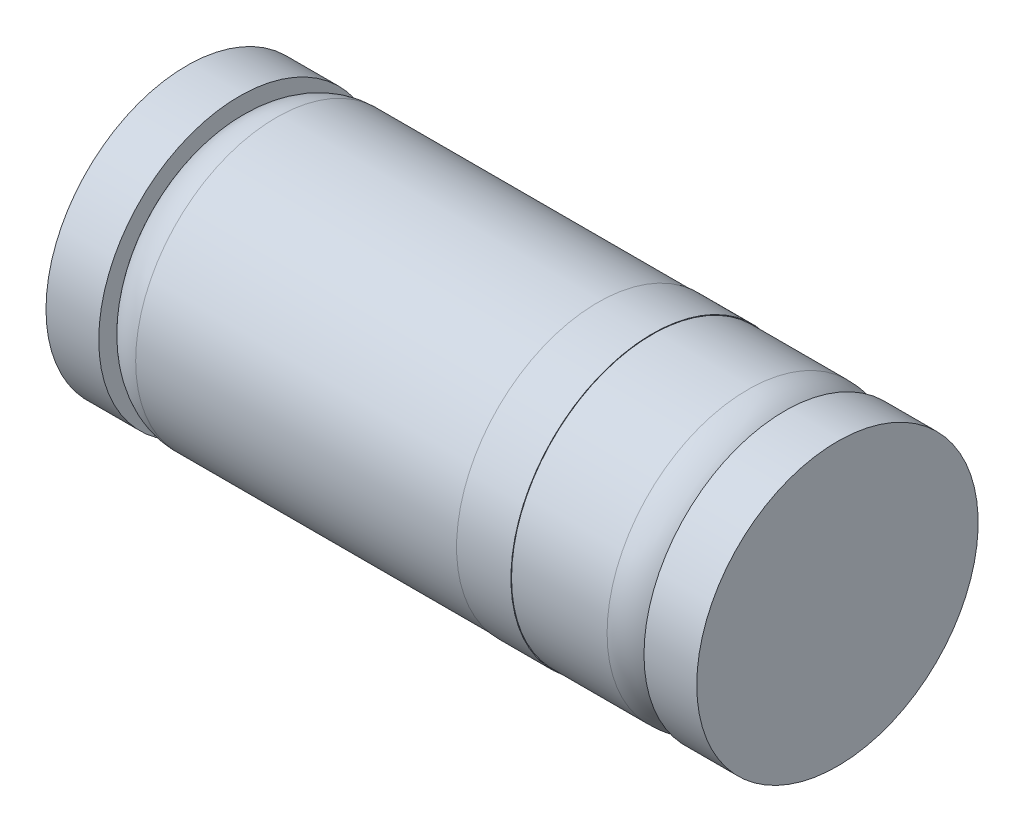
ISO-10303-21;
HEADER;
FILE_DESCRIPTION(('STEP AP214'),'2;1');
FILE_NAME('part.step','',(''),(''),'','','');
FILE_SCHEMA(('AUTOMOTIVE_DESIGN { 1 0 10303 214 1 1 1 1 }'));
ENDSEC;
DATA;
#1=APPLICATION_CONTEXT('core data for automotive mechanical design processes');
#2=APPLICATION_PROTOCOL_DEFINITION('international standard','automotive_design',2000,#1);
#3=PRODUCT_CONTEXT('',#1,'mechanical');
#4=PRODUCT('Part','Part','',(#3));
#5=PRODUCT_RELATED_PRODUCT_CATEGORY('part','',(#4));
#6=PRODUCT_DEFINITION_FORMATION('','',#4);
#7=PRODUCT_DEFINITION_CONTEXT('part definition',#1,'design');
#8=PRODUCT_DEFINITION('design','',#6,#7);
#9=PRODUCT_DEFINITION_SHAPE('','',#8);
#10=(LENGTH_UNIT() NAMED_UNIT(*) SI_UNIT(.MILLI.,.METRE.));
#11=(NAMED_UNIT(*) PLANE_ANGLE_UNIT() SI_UNIT($,.RADIAN.));
#12=(NAMED_UNIT(*) SI_UNIT($,.STERADIAN.) SOLID_ANGLE_UNIT());
#13=UNCERTAINTY_MEASURE_WITH_UNIT(LENGTH_MEASURE(1.E-05),#10,'distance_accuracy_value','');
#14=(GEOMETRIC_REPRESENTATION_CONTEXT(3) GLOBAL_UNCERTAINTY_ASSIGNED_CONTEXT((#13)) GLOBAL_UNIT_ASSIGNED_CONTEXT((#10,
#11,#12)) REPRESENTATION_CONTEXT('',''));
#15=CARTESIAN_POINT('',(0.,0.,0.));
#16=DIRECTION('',(0.,0.,1.));
#17=DIRECTION('',(1.,0.,0.));
#18=AXIS2_PLACEMENT_3D('',#15,#16,#17);
#19=CARTESIAN_POINT('',(-25.7120986119701,9.99999999999995,0.799999999999995));
#20=DIRECTION('',(-1.,0.,0.));
#21=DIRECTION('',(0.,0.,1.));
#22=AXIS2_PLACEMENT_3D('',#19,#20,#21);
#23=PLANE('',#22);
#24=CARTESIAN_POINT('',(-25.71209861197,9.19999999999994,0.799999999999995));
#25=DIRECTION('',(1.,0.,0.));
#26=DIRECTION('',(0.,0.,-1.));
#27=AXIS2_PLACEMENT_3D('',#24,#25,#26);
#28=CIRCLE('',#27,0.803520381198);
#29=CARTESIAN_POINT('',(-25.71209861197,9.19999999999994,-0.00352038119800482));
#30=VERTEX_POINT('',#29);
#31=EDGE_CURVE('P0_E17',#30,#30,#28,.T.);
#32=ORIENTED_EDGE('',*,*,#31,.F.);
#33=EDGE_LOOP('',(#32));
#34=FACE_BOUND('',#33,.T.);
#35=ADVANCED_FACE('P0_F14',(#34),#23,.T.);
#36=CARTESIAN_POINT('',(-25.40309439956,9.2,0.799999999999995));
#37=DIRECTION('',(1.,0.,0.));
#38=DIRECTION('',(0.,0.,-1.));
#39=AXIS2_PLACEMENT_3D('',#36,#37,#38);
#40=CYLINDRICAL_SURFACE('',#39,0.803520381198);
#41=ORIENTED_EDGE('',*,*,#31,.T.);
#42=EDGE_LOOP('',(#41));
#43=FACE_BOUND('',#42,.T.);
#44=CARTESIAN_POINT('',(-25.40309439956,9.2,0.799999999999995));
#45=DIRECTION('',(1.,0.,0.));
#46=DIRECTION('',(0.,0.,-1.));
#47=AXIS2_PLACEMENT_3D('',#44,#45,#46);
#48=CIRCLE('',#47,0.803520381198);
#49=CARTESIAN_POINT('',(-25.40309439956,9.2,-0.00352038119800482));
#50=VERTEX_POINT('',#49);
#51=EDGE_CURVE('P0_E10',#50,#50,#48,.T.);
#52=ORIENTED_EDGE('',*,*,#51,.F.);
#53=EDGE_LOOP('',(#52));
#54=FACE_BOUND('',#53,.T.);
#55=ADVANCED_FACE('P0_F26',(#43,#54),#40,.T.);
#56=CARTESIAN_POINT('',(-25.4030943995601,9.99999999999999,0.799999999999995));
#57=DIRECTION('',(1.,0.,0.));
#58=DIRECTION('',(0.,0.,-1.));
#59=AXIS2_PLACEMENT_3D('',#56,#57,#58);
#60=PLANE('',#59);
#61=ORIENTED_EDGE('',*,*,#51,.T.);
#62=EDGE_LOOP('',(#61));
#63=FACE_BOUND('',#62,.T.);
#64=ADVANCED_FACE('P0_F34',(#63),#60,.T.);
#65=CLOSED_SHELL('',(#35,#55,#64));
#66=MANIFOLD_SOLID_BREP('P0_B1',#65);
#67=CARTESIAN_POINT('',(-24.35,9.2,0.799999999999995));
#68=DIRECTION('',(-1.,0.,0.));
#69=DIRECTION('',(0.,0.,1.));
#70=AXIS2_PLACEMENT_3D('',#67,#68,#69);
#71=PLANE('',#70);
#72=CARTESIAN_POINT('',(-24.35,9.2,0.799999999999995));
#73=DIRECTION('',(-1.,0.,0.));
#74=DIRECTION('',(0.,0.,1.));
#75=AXIS2_PLACEMENT_3D('',#72,#73,#74);
#76=CIRCLE('',#75,0.8);
#77=CARTESIAN_POINT('',(-24.35,9.2,1.59999999999999));
#78=VERTEX_POINT('',#77);
#79=EDGE_CURVE('P1_E17',#78,#78,#76,.T.);
#80=ORIENTED_EDGE('',*,*,#79,.F.);
#81=EDGE_LOOP('',(#80));
#82=FACE_BOUND('',#81,.T.);
#83=ADVANCED_FACE('P1_F14',(#82),#71,.F.);
#84=CARTESIAN_POINT('',(-28.05,9.19999999999994,0.799999999999988));
#85=DIRECTION('',(1.,0.,0.));
#86=DIRECTION('',(0.,0.,-1.));
#87=AXIS2_PLACEMENT_3D('',#84,#85,#86);
#88=PLANE('',#87);
#89=CARTESIAN_POINT('',(-28.05,9.19999999999994,0.799999999999988));
#90=DIRECTION('',(-1.,0.,0.));
#91=DIRECTION('',(0.,0.,1.));
#92=AXIS2_PLACEMENT_3D('',#89,#90,#91);
#93=CIRCLE('',#92,0.8);
#94=CARTESIAN_POINT('',(-28.05,9.19999999999994,1.59999999999999));
#95=VERTEX_POINT('',#94);
#96=EDGE_CURVE('P1_E61',#95,#95,#93,.F.);
#97=ORIENTED_EDGE('',*,*,#96,.F.);
#98=EDGE_LOOP('',(#97));
#99=FACE_BOUND('',#98,.T.);
#100=ADVANCED_FACE('P1_F71',(#99),#88,.F.);
#101=CARTESIAN_POINT('',(-28.05,9.19999999999994,0.799999999999988));
#102=DIRECTION('',(-1.,0.,0.));
#103=DIRECTION('',(0.,0.,1.));
#104=AXIS2_PLACEMENT_3D('',#101,#102,#103);
#105=CYLINDRICAL_SURFACE('',#104,0.8);
#106=CARTESIAN_POINT('',(-24.65,9.2,0.799999999999995));
#107=DIRECTION('',(-1.,0.,0.));
#108=DIRECTION('',(0.,0.,1.));
#109=AXIS2_PLACEMENT_3D('',#106,#107,#108);
#110=CIRCLE('',#109,0.8);
#111=CARTESIAN_POINT('',(-24.65,9.2,1.59999999999999));
#112=VERTEX_POINT('',#111);
#113=EDGE_CURVE('P1_E59',#112,#112,#110,.F.);
#114=ORIENTED_EDGE('',*,*,#113,.T.);
#115=EDGE_LOOP('',(#114));
#116=FACE_BOUND('',#115,.T.);
#117=ORIENTED_EDGE('',*,*,#79,.T.);
#118=EDGE_LOOP('',(#117));
#119=FACE_BOUND('',#118,.T.);
#120=ADVANCED_FACE('P1_F68',(#116,#119),#105,.T.);
#121=CARTESIAN_POINT('',(-28.05,9.19999999999994,0.799999999999988));
#122=DIRECTION('',(-1.,0.,0.));
#123=DIRECTION('',(0.,0.,1.));
#124=AXIS2_PLACEMENT_3D('',#121,#122,#123);
#125=CYLINDRICAL_SURFACE('',#124,0.8);
#126=ORIENTED_EDGE('',*,*,#96,.T.);
#127=EDGE_LOOP('',(#126));
#128=FACE_BOUND('',#127,.T.);
#129=CARTESIAN_POINT('',(-27.75,9.19999999999994,0.799999999999995));
#130=DIRECTION('',(-1.,0.,0.));
#131=DIRECTION('',(0.,0.,1.));
#132=AXIS2_PLACEMENT_3D('',#129,#130,#131);
#133=CIRCLE('',#132,0.8);
#134=CARTESIAN_POINT('',(-27.75,9.19999999999994,1.59999999999999));
#135=VERTEX_POINT('',#134);
#136=EDGE_CURVE('P1_E56',#135,#135,#133,.T.);
#137=ORIENTED_EDGE('',*,*,#136,.T.);
#138=EDGE_LOOP('',(#137));
#139=FACE_BOUND('',#138,.T.);
#140=ADVANCED_FACE('P1_F93',(#128,#139),#125,.T.);
#141=CARTESIAN_POINT('',(-24.6500000000001,9.99999999999999,0.799999999999995));
#142=DIRECTION('',(1.,0.,0.));
#143=DIRECTION('',(0.,0.,-1.));
#144=AXIS2_PLACEMENT_3D('',#141,#142,#143);
#145=PLANE('',#144);
#146=ORIENTED_EDGE('',*,*,#113,.F.);
#147=EDGE_LOOP('',(#146));
#148=FACE_BOUND('',#147,.T.);
#149=CARTESIAN_POINT('',(-24.6500000000575,9.2,0.799999999999995));
#150=DIRECTION('',(-1.,0.,0.));
#151=DIRECTION('',(0.,0.,1.));
#152=AXIS2_PLACEMENT_3D('',#149,#150,#151);
#153=CIRCLE('',#152,0.693019955690488);
#154=CARTESIAN_POINT('',(-24.6500000000575,9.2,1.49301995569048));
#155=VERTEX_POINT('',#154);
#156=EDGE_CURVE('P1_E53',#155,#155,#153,.T.);
#157=ORIENTED_EDGE('',*,*,#156,.F.);
#158=EDGE_LOOP('',(#157));
#159=FACE_BOUND('',#158,.T.);
#160=ADVANCED_FACE('P1_F91',(#148,#159),#145,.F.);
#161=CARTESIAN_POINT('',(-27.75,9.99999999999995,0.799999999999995));
#162=DIRECTION('',(-1.,0.,0.));
#163=DIRECTION('',(0.,0.,1.));
#164=AXIS2_PLACEMENT_3D('',#161,#162,#163);
#165=PLANE('',#164);
#166=CARTESIAN_POINT('',(-27.7499999998927,9.19999999999994,0.799999999999995));
#167=DIRECTION('',(1.,0.,0.));
#168=DIRECTION('',(0.,0.,-1.));
#169=AXIS2_PLACEMENT_3D('',#166,#167,#168);
#170=CIRCLE('',#169,0.693019955690488);
#171=CARTESIAN_POINT('',(-27.7499999998927,9.19999999999994,0.106980044309507));
#172=VERTEX_POINT('',#171);
#173=EDGE_CURVE('P1_E50',#172,#172,#170,.T.);
#174=ORIENTED_EDGE('',*,*,#173,.F.);
#175=EDGE_LOOP('',(#174));
#176=FACE_BOUND('',#175,.T.);
#177=ORIENTED_EDGE('',*,*,#136,.F.);
#178=EDGE_LOOP('',(#177));
#179=FACE_BOUND('',#178,.T.);
#180=ADVANCED_FACE('P1_F88',(#176,#179),#165,.F.);
#181=CARTESIAN_POINT('',(-24.6510787919192,9.2,0.799999999999995));
#182=DIRECTION('',(-1.,0.,0.));
#183=DIRECTION('',(0.,0.,1.));
#184=AXIS2_PLACEMENT_3D('',#181,#182,#183);
#185=CONICAL_SURFACE('',#184,0.694485076648289,0.936110716331469);
#186=CARTESIAN_POINT('',(-24.6510787920219,9.2,0.799999999999995));
#187=DIRECTION('',(-1.,0.,0.));
#188=DIRECTION('',(0.,0.,1.));
#189=AXIS2_PLACEMENT_3D('',#186,#187,#188);
#190=CIRCLE('',#189,0.694485076845569);
#191=CARTESIAN_POINT('',(-24.6510787920219,9.2,1.49448507684556));
#192=VERTEX_POINT('',#191);
#193=EDGE_CURVE('P1_E47',#192,#192,#190,.T.);
#194=ORIENTED_EDGE('',*,*,#193,.F.);
#195=EDGE_LOOP('',(#194));
#196=FACE_BOUND('',#195,.T.);
#197=ORIENTED_EDGE('',*,*,#156,.T.);
#198=EDGE_LOOP('',(#197));
#199=FACE_BOUND('',#198,.T.);
#200=ADVANCED_FACE('P1_F85',(#196,#199),#185,.T.);
#201=CARTESIAN_POINT('',(-27.7489212078876,9.19999999999994,0.799999999999995));
#202=DIRECTION('',(1.,0.,0.));
#203=DIRECTION('',(0.,0.,-1.));
#204=AXIS2_PLACEMENT_3D('',#201,#202,#203);
#205=CONICAL_SURFACE('',#204,0.694485076765704,0.936110691173423);
#206=CARTESIAN_POINT('',(-27.7489212079681,9.19999999999994,0.799999999999995));
#207=DIRECTION('',(-1.,0.,0.));
#208=DIRECTION('',(0.,0.,1.));
#209=AXIS2_PLACEMENT_3D('',#206,#207,#208);
#210=CIRCLE('',#209,0.694485076845569);
#211=CARTESIAN_POINT('',(-27.7489212079681,9.19999999999994,1.49448507684556));
#212=VERTEX_POINT('',#211);
#213=EDGE_CURVE('P1_E26',#212,#212,#210,.F.);
#214=ORIENTED_EDGE('',*,*,#213,.F.);
#215=EDGE_LOOP('',(#214));
#216=FACE_BOUND('',#215,.T.);
#217=ORIENTED_EDGE('',*,*,#173,.T.);
#218=EDGE_LOOP('',(#217));
#219=FACE_BOUND('',#218,.T.);
#220=ADVANCED_FACE('P1_F42',(#216,#219),#205,.T.);
#221=CARTESIAN_POINT('',(-24.85980352904,9.2,0.799999999999995));
#222=DIRECTION('',(-1.,0.,0.));
#223=DIRECTION('',(0.,0.,1.));
#224=AXIS2_PLACEMENT_3D('',#221,#222,#223);
#225=TOROIDAL_SURFACE('',#224,0.540797731656002,0.259202268344);
#226=CARTESIAN_POINT('',(-24.85980352904,9.2,0.799999999999995));
#227=DIRECTION('',(-1.,0.,0.));
#228=DIRECTION('',(0.,0.,1.));
#229=AXIS2_PLACEMENT_3D('',#226,#227,#228);
#230=CIRCLE('',#229,0.8);
#231=CARTESIAN_POINT('',(-24.85980352904,9.2,1.59999999999999));
#232=VERTEX_POINT('',#231);
#233=EDGE_CURVE('P1_E21',#232,#232,#230,.T.);
#234=ORIENTED_EDGE('',*,*,#233,.F.);
#235=EDGE_LOOP('',(#234));
#236=FACE_BOUND('',#235,.T.);
#237=ORIENTED_EDGE('',*,*,#193,.T.);
#238=EDGE_LOOP('',(#237));
#239=FACE_BOUND('',#238,.T.);
#240=ADVANCED_FACE('P1_F38',(#236,#239),#225,.T.);
#241=CARTESIAN_POINT('',(-27.54019647095,9.19999999999994,0.799999999999995));
#242=DIRECTION('',(-1.,0.,0.));
#243=DIRECTION('',(0.,0.,1.));
#244=AXIS2_PLACEMENT_3D('',#241,#242,#243);
#245=TOROIDAL_SURFACE('',#244,0.540797731656002,0.259202268344);
#246=ORIENTED_EDGE('',*,*,#213,.T.);
#247=EDGE_LOOP('',(#246));
#248=FACE_BOUND('',#247,.T.);
#249=CARTESIAN_POINT('',(-27.54019647095,9.19999999999994,0.799999999999995));
#250=DIRECTION('',(-1.,0.,0.));
#251=DIRECTION('',(0.,0.,1.));
#252=AXIS2_PLACEMENT_3D('',#249,#250,#251);
#253=CIRCLE('',#252,0.8);
#254=CARTESIAN_POINT('',(-27.54019647095,9.19999999999994,1.59999999999999));
#255=VERTEX_POINT('',#254);
#256=EDGE_CURVE('P1_E10',#255,#255,#253,.F.);
#257=ORIENTED_EDGE('',*,*,#256,.F.);
#258=EDGE_LOOP('',(#257));
#259=FACE_BOUND('',#258,.T.);
#260=ADVANCED_FACE('P1_F33',(#248,#259),#245,.T.);
#261=CARTESIAN_POINT('',(-28.05,9.19999999999994,0.799999999999988));
#262=DIRECTION('',(-1.,0.,0.));
#263=DIRECTION('',(0.,0.,1.));
#264=AXIS2_PLACEMENT_3D('',#261,#262,#263);
#265=CYLINDRICAL_SURFACE('',#264,0.8);
#266=ORIENTED_EDGE('',*,*,#256,.T.);
#267=EDGE_LOOP('',(#266));
#268=FACE_BOUND('',#267,.T.);
#269=ORIENTED_EDGE('',*,*,#233,.T.);
#270=EDGE_LOOP('',(#269));
#271=FACE_BOUND('',#270,.T.);
#272=ADVANCED_FACE('P1_F37',(#268,#271),#265,.T.);
#273=CLOSED_SHELL('',(#83,#100,#120,#140,#160,#180,#200,#220,#240,#260,#272));
#274=MANIFOLD_SOLID_BREP('P1_B1',#273);
#275=ADVANCED_BREP_SHAPE_REPRESENTATION('',(#18,#66,#274),#14);
#276=SHAPE_DEFINITION_REPRESENTATION(#9,#275);
ENDSEC;
END-ISO-10303-21;
